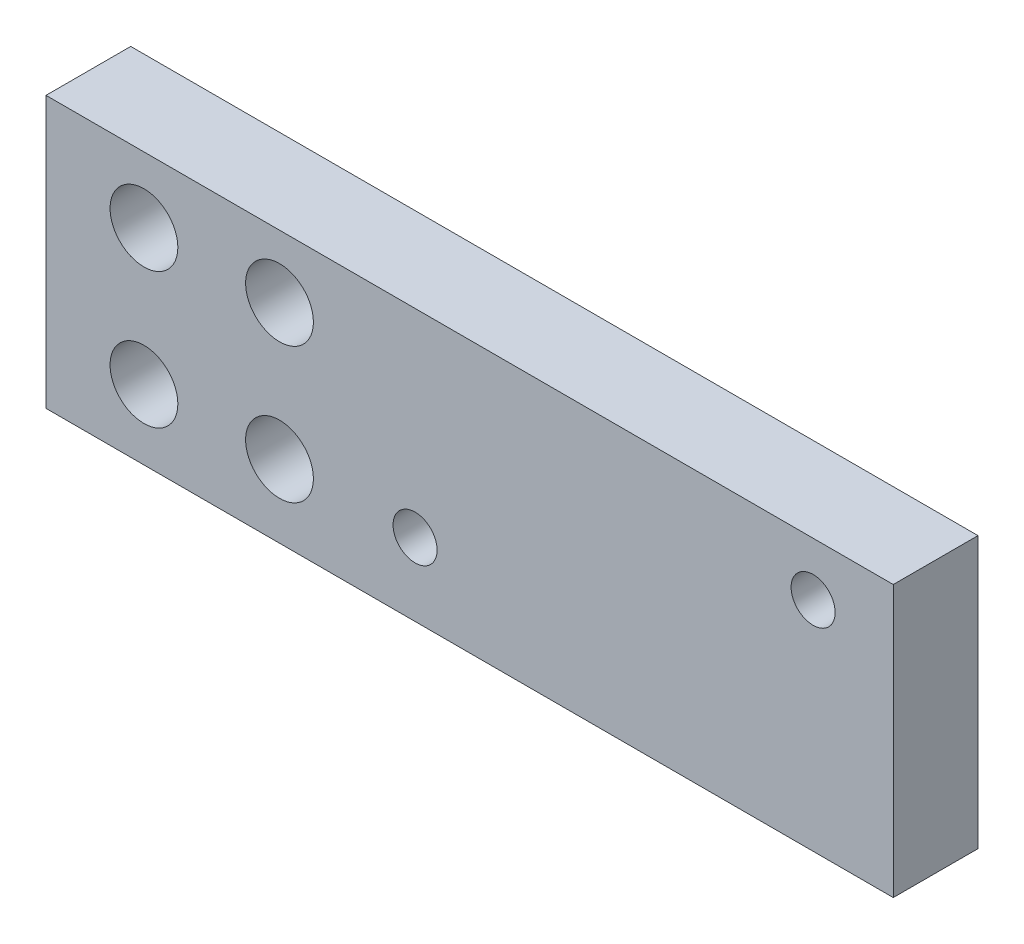
ISO-10303-21;
HEADER;
FILE_DESCRIPTION(('STEP AP214'),'2;1');
FILE_NAME('part.step','',(''),(''),'','','');
FILE_SCHEMA(('AUTOMOTIVE_DESIGN { 1 0 10303 214 1 1 1 1 }'));
ENDSEC;
DATA;
#1=APPLICATION_CONTEXT('core data for automotive mechanical design processes');
#2=APPLICATION_PROTOCOL_DEFINITION('international standard','automotive_design',2000,#1);
#3=PRODUCT_CONTEXT('',#1,'mechanical');
#4=PRODUCT('Part','Part','',(#3));
#5=PRODUCT_RELATED_PRODUCT_CATEGORY('part','',(#4));
#6=PRODUCT_DEFINITION_FORMATION('','',#4);
#7=PRODUCT_DEFINITION_CONTEXT('part definition',#1,'design');
#8=PRODUCT_DEFINITION('design','',#6,#7);
#9=PRODUCT_DEFINITION_SHAPE('','',#8);
#10=(LENGTH_UNIT() NAMED_UNIT(*) SI_UNIT(.MILLI.,.METRE.));
#11=(NAMED_UNIT(*) PLANE_ANGLE_UNIT() SI_UNIT($,.RADIAN.));
#12=(NAMED_UNIT(*) SI_UNIT($,.STERADIAN.) SOLID_ANGLE_UNIT());
#13=UNCERTAINTY_MEASURE_WITH_UNIT(LENGTH_MEASURE(1.E-05),#10,'distance_accuracy_value','');
#14=(GEOMETRIC_REPRESENTATION_CONTEXT(3) GLOBAL_UNCERTAINTY_ASSIGNED_CONTEXT((#13)) GLOBAL_UNIT_ASSIGNED_CONTEXT((#10,
#11,#12)) REPRESENTATION_CONTEXT('',''));
#15=CARTESIAN_POINT('',(0.,0.,0.));
#16=DIRECTION('',(0.,0.,1.));
#17=DIRECTION('',(1.,0.,0.));
#18=AXIS2_PLACEMENT_3D('',#15,#16,#17);
#19=CARTESIAN_POINT('',(0.,0.,5.));
#20=DIRECTION('',(0.,0.,-1.));
#21=DIRECTION('',(-1.,0.,0.));
#22=AXIS2_PLACEMENT_3D('',#19,#20,#21);
#23=PLANE('',#22);
#24=DIRECTION('',(1.,0.,0.));
#25=VECTOR('',#24,1.);
#26=CARTESIAN_POINT('',(-22.7860750602087,3.89851485148514,5.));
#27=LINE('',#26,#25);
#28=CARTESIAN_POINT('',(-22.7860750602087,3.89851485148514,5.));
#29=VERTEX_POINT('',#28);
#30=CARTESIAN_POINT('',(27.2139249397913,3.89851485148514,5.));
#31=VERTEX_POINT('',#30);
#32=EDGE_CURVE('E184',#29,#31,#27,.T.);
#33=ORIENTED_EDGE('',*,*,#32,.F.);
#34=DIRECTION('',(0.,-1.,0.));
#35=VECTOR('',#34,1.);
#36=CARTESIAN_POINT('',(-22.7860750602087,3.89851485148514,5.));
#37=LINE('',#36,#35);
#38=CARTESIAN_POINT('',(-22.7860750602087,-12.1014851485149,5.));
#39=VERTEX_POINT('',#38);
#40=EDGE_CURVE('E174',#29,#39,#37,.T.);
#41=ORIENTED_EDGE('',*,*,#40,.T.);
#42=DIRECTION('',(1.,0.,0.));
#43=VECTOR('',#42,1.);
#44=CARTESIAN_POINT('',(-22.7860750602087,-12.1014851485149,5.));
#45=LINE('',#44,#43);
#46=CARTESIAN_POINT('',(27.2139249397913,-12.1014851485149,5.));
#47=VERTEX_POINT('',#46);
#48=EDGE_CURVE('E169',#39,#47,#45,.T.);
#49=ORIENTED_EDGE('',*,*,#48,.T.);
#50=DIRECTION('',(0.,-1.,0.));
#51=VECTOR('',#50,1.);
#52=CARTESIAN_POINT('',(27.2139249397913,3.89851485148514,5.));
#53=LINE('',#52,#51);
#54=EDGE_CURVE('E173',#31,#47,#53,.T.);
#55=ORIENTED_EDGE('',*,*,#54,.F.);
#56=EDGE_LOOP('',(#33,#41,#49,#55));
#57=FACE_BOUND('',#56,.T.);
#58=CARTESIAN_POINT('',(22.4839383449832,0.74863983720937,5.));
#59=DIRECTION('',(0.,0.,1.));
#60=DIRECTION('',(1.,0.,0.));
#61=AXIS2_PLACEMENT_3D('',#58,#59,#60);
#62=CIRCLE('',#61,1.3);
#63=CARTESIAN_POINT('',(23.7839383449832,0.74863983720937,5.));
#64=VERTEX_POINT('',#63);
#65=EDGE_CURVE('E194',#64,#64,#62,.T.);
#66=ORIENTED_EDGE('',*,*,#65,.F.);
#67=EDGE_LOOP('',(#66));
#68=FACE_BOUND('',#67,.T.);
#69=CARTESIAN_POINT('',(-17.0059691899728,-7.98267326732673,5.));
#70=DIRECTION('',(0.,0.,1.));
#71=DIRECTION('',(1.,0.,0.));
#72=AXIS2_PLACEMENT_3D('',#69,#70,#71);
#73=CIRCLE('',#72,2.);
#74=CARTESIAN_POINT('',(-15.0059691899728,-7.98267326732673,5.));
#75=VERTEX_POINT('',#74);
#76=EDGE_CURVE('E237',#75,#75,#73,.T.);
#77=ORIENTED_EDGE('',*,*,#76,.F.);
#78=EDGE_LOOP('',(#77));
#79=FACE_BOUND('',#78,.T.);
#80=CARTESIAN_POINT('',(-17.0059691899728,0.0173267326732673,5.));
#81=DIRECTION('',(0.,0.,1.));
#82=DIRECTION('',(1.,0.,0.));
#83=AXIS2_PLACEMENT_3D('',#80,#81,#82);
#84=CIRCLE('',#83,2.);
#85=CARTESIAN_POINT('',(-15.0059691899728,0.0173267326732673,5.));
#86=VERTEX_POINT('',#85);
#87=EDGE_CURVE('E244',#86,#86,#84,.T.);
#88=ORIENTED_EDGE('',*,*,#87,.F.);
#89=EDGE_LOOP('',(#88));
#90=FACE_BOUND('',#89,.T.);
#91=CARTESIAN_POINT('',(-1.00596918997278,-7.80847673317924,5.));
#92=DIRECTION('',(0.,0.,1.));
#93=DIRECTION('',(1.,0.,0.));
#94=AXIS2_PLACEMENT_3D('',#91,#92,#93);
#95=CIRCLE('',#94,1.3);
#96=CARTESIAN_POINT('',(0.29403081002722,-7.80847673317924,5.));
#97=VERTEX_POINT('',#96);
#98=EDGE_CURVE('E249',#97,#97,#95,.T.);
#99=ORIENTED_EDGE('',*,*,#98,.F.);
#100=EDGE_LOOP('',(#99));
#101=FACE_BOUND('',#100,.T.);
#102=CARTESIAN_POINT('',(-9.00596918997278,-7.80847673317924,5.));
#103=DIRECTION('',(0.,0.,1.));
#104=DIRECTION('',(1.,0.,0.));
#105=AXIS2_PLACEMENT_3D('',#102,#103,#104);
#106=CIRCLE('',#105,2.);
#107=CARTESIAN_POINT('',(-7.00596918997278,-7.80847673317924,5.));
#108=VERTEX_POINT('',#107);
#109=EDGE_CURVE('E255',#108,#108,#106,.T.);
#110=ORIENTED_EDGE('',*,*,#109,.F.);
#111=EDGE_LOOP('',(#110));
#112=FACE_BOUND('',#111,.T.);
#113=CARTESIAN_POINT('',(-9.00596918997278,0.191523266820761,5.));
#114=DIRECTION('',(0.,0.,1.));
#115=DIRECTION('',(1.,0.,0.));
#116=AXIS2_PLACEMENT_3D('',#113,#114,#115);
#117=CIRCLE('',#116,2.);
#118=CARTESIAN_POINT('',(-7.00596918997278,0.191523266820761,5.));
#119=VERTEX_POINT('',#118);
#120=EDGE_CURVE('E261',#119,#119,#117,.T.);
#121=ORIENTED_EDGE('',*,*,#120,.F.);
#122=EDGE_LOOP('',(#121));
#123=FACE_BOUND('',#122,.T.);
#124=ADVANCED_FACE('F123',(#57,#68,#79,#90,#101,#112,#123),#23,.F.);
#125=CARTESIAN_POINT('',(0.,0.,0.));
#126=DIRECTION('',(0.,0.,-1.));
#127=DIRECTION('',(-1.,0.,0.));
#128=AXIS2_PLACEMENT_3D('',#125,#126,#127);
#129=PLANE('',#128);
#130=CARTESIAN_POINT('',(-9.00596918997278,-7.80847673317924,0.));
#131=DIRECTION('',(0.,0.,1.));
#132=DIRECTION('',(1.,0.,0.));
#133=AXIS2_PLACEMENT_3D('',#130,#131,#132);
#134=CIRCLE('',#133,2.);
#135=CARTESIAN_POINT('',(-7.00596918997278,-7.80847673317924,0.));
#136=VERTEX_POINT('',#135);
#137=EDGE_CURVE('E258',#136,#136,#134,.T.);
#138=ORIENTED_EDGE('',*,*,#137,.T.);
#139=EDGE_LOOP('',(#138));
#140=FACE_BOUND('',#139,.T.);
#141=CARTESIAN_POINT('',(-17.0059691899728,0.0173267326732673,0.));
#142=DIRECTION('',(0.,0.,1.));
#143=DIRECTION('',(1.,0.,0.));
#144=AXIS2_PLACEMENT_3D('',#141,#142,#143);
#145=CIRCLE('',#144,2.);
#146=CARTESIAN_POINT('',(-15.0059691899728,0.0173267326732673,0.));
#147=VERTEX_POINT('',#146);
#148=EDGE_CURVE('E246',#147,#147,#145,.T.);
#149=ORIENTED_EDGE('',*,*,#148,.T.);
#150=EDGE_LOOP('',(#149));
#151=FACE_BOUND('',#150,.T.);
#152=CARTESIAN_POINT('',(22.4839383449832,0.74863983720937,0.));
#153=DIRECTION('',(0.,0.,1.));
#154=DIRECTION('',(1.,0.,0.));
#155=AXIS2_PLACEMENT_3D('',#152,#153,#154);
#156=CIRCLE('',#155,1.3);
#157=CARTESIAN_POINT('',(23.7839383449832,0.74863983720937,0.));
#158=VERTEX_POINT('',#157);
#159=EDGE_CURVE('E235',#158,#158,#156,.T.);
#160=ORIENTED_EDGE('',*,*,#159,.T.);
#161=EDGE_LOOP('',(#160));
#162=FACE_BOUND('',#161,.T.);
#163=DIRECTION('',(1.,0.,0.));
#164=VECTOR('',#163,1.);
#165=CARTESIAN_POINT('',(-22.7860750602087,3.89851485148514,0.));
#166=LINE('',#165,#164);
#167=CARTESIAN_POINT('',(-22.7860750602087,3.89851485148514,0.));
#168=VERTEX_POINT('',#167);
#169=CARTESIAN_POINT('',(27.2139249397913,3.89851485148514,0.));
#170=VERTEX_POINT('',#169);
#171=EDGE_CURVE('E190',#168,#170,#166,.T.);
#172=ORIENTED_EDGE('',*,*,#171,.T.);
#173=DIRECTION('',(0.,-1.,0.));
#174=VECTOR('',#173,1.);
#175=CARTESIAN_POINT('',(27.2139249397913,3.89851485148514,0.));
#176=LINE('',#175,#174);
#177=CARTESIAN_POINT('',(27.2139249397913,-12.1014851485149,0.));
#178=VERTEX_POINT('',#177);
#179=EDGE_CURVE('E193',#170,#178,#176,.T.);
#180=ORIENTED_EDGE('',*,*,#179,.T.);
#181=DIRECTION('',(1.,0.,0.));
#182=VECTOR('',#181,1.);
#183=CARTESIAN_POINT('',(-22.7860750602087,-12.1014851485149,0.));
#184=LINE('',#183,#182);
#185=CARTESIAN_POINT('',(-22.7860750602087,-12.1014851485149,0.));
#186=VERTEX_POINT('',#185);
#187=EDGE_CURVE('E181',#186,#178,#184,.T.);
#188=ORIENTED_EDGE('',*,*,#187,.F.);
#189=DIRECTION('',(0.,-1.,0.));
#190=VECTOR('',#189,1.);
#191=CARTESIAN_POINT('',(-22.7860750602087,3.89851485148514,0.));
#192=LINE('',#191,#190);
#193=EDGE_CURVE('E157',#168,#186,#192,.T.);
#194=ORIENTED_EDGE('',*,*,#193,.F.);
#195=EDGE_LOOP('',(#172,#180,#188,#194));
#196=FACE_BOUND('',#195,.T.);
#197=CARTESIAN_POINT('',(-17.0059691899728,-7.98267326732673,0.));
#198=DIRECTION('',(0.,0.,1.));
#199=DIRECTION('',(1.,0.,0.));
#200=AXIS2_PLACEMENT_3D('',#197,#198,#199);
#201=CIRCLE('',#200,2.);
#202=CARTESIAN_POINT('',(-15.0059691899728,-7.98267326732673,0.));
#203=VERTEX_POINT('',#202);
#204=EDGE_CURVE('E240',#203,#203,#201,.T.);
#205=ORIENTED_EDGE('',*,*,#204,.T.);
#206=EDGE_LOOP('',(#205));
#207=FACE_BOUND('',#206,.T.);
#208=CARTESIAN_POINT('',(-1.00596918997278,-7.80847673317924,0.));
#209=DIRECTION('',(0.,0.,1.));
#210=DIRECTION('',(1.,0.,0.));
#211=AXIS2_PLACEMENT_3D('',#208,#209,#210);
#212=CIRCLE('',#211,1.3);
#213=CARTESIAN_POINT('',(0.29403081002722,-7.80847673317924,0.));
#214=VERTEX_POINT('',#213);
#215=EDGE_CURVE('E252',#214,#214,#212,.T.);
#216=ORIENTED_EDGE('',*,*,#215,.T.);
#217=EDGE_LOOP('',(#216));
#218=FACE_BOUND('',#217,.T.);
#219=CARTESIAN_POINT('',(-9.00596918997278,0.191523266820761,0.));
#220=DIRECTION('',(0.,0.,1.));
#221=DIRECTION('',(1.,0.,0.));
#222=AXIS2_PLACEMENT_3D('',#219,#220,#221);
#223=CIRCLE('',#222,2.);
#224=CARTESIAN_POINT('',(-7.00596918997278,0.191523266820761,0.));
#225=VERTEX_POINT('',#224);
#226=EDGE_CURVE('E264',#225,#225,#223,.T.);
#227=ORIENTED_EDGE('',*,*,#226,.T.);
#228=EDGE_LOOP('',(#227));
#229=FACE_BOUND('',#228,.T.);
#230=ADVANCED_FACE('F199',(#140,#151,#162,#196,#207,#218,#229),#129,.T.);
#231=CARTESIAN_POINT('',(-22.7860750602087,3.89851485148514,5.));
#232=DIRECTION('',(0.,1.,0.));
#233=DIRECTION('',(0.,0.,1.));
#234=AXIS2_PLACEMENT_3D('',#231,#232,#233);
#235=PLANE('',#234);
#236=ORIENTED_EDGE('',*,*,#171,.F.);
#237=DIRECTION('',(0.,0.,-1.));
#238=VECTOR('',#237,1.);
#239=CARTESIAN_POINT('',(-22.7860750602087,3.89851485148514,5.));
#240=LINE('',#239,#238);
#241=EDGE_CURVE('E12',#29,#168,#240,.T.);
#242=ORIENTED_EDGE('',*,*,#241,.F.);
#243=ORIENTED_EDGE('',*,*,#32,.T.);
#244=DIRECTION('',(0.,0.,-1.));
#245=VECTOR('',#244,1.);
#246=CARTESIAN_POINT('',(27.2139249397913,3.89851485148514,5.));
#247=LINE('',#246,#245);
#248=EDGE_CURVE('E127',#31,#170,#247,.T.);
#249=ORIENTED_EDGE('',*,*,#248,.T.);
#250=EDGE_LOOP('',(#236,#242,#243,#249));
#251=FACE_BOUND('',#250,.T.);
#252=ADVANCED_FACE('F125',(#251),#235,.T.);
#253=CARTESIAN_POINT('',(-22.7860750602087,3.89851485148514,5.));
#254=DIRECTION('',(1.,0.,0.));
#255=DIRECTION('',(0.,0.,-1.));
#256=AXIS2_PLACEMENT_3D('',#253,#254,#255);
#257=PLANE('',#256);
#258=ORIENTED_EDGE('',*,*,#193,.T.);
#259=DIRECTION('',(0.,0.,-1.));
#260=VECTOR('',#259,1.);
#261=CARTESIAN_POINT('',(-22.7860750602087,-12.1014851485149,5.));
#262=LINE('',#261,#260);
#263=EDGE_CURVE('E133',#39,#186,#262,.T.);
#264=ORIENTED_EDGE('',*,*,#263,.F.);
#265=ORIENTED_EDGE('',*,*,#40,.F.);
#266=ORIENTED_EDGE('',*,*,#241,.T.);
#267=EDGE_LOOP('',(#258,#264,#265,#266));
#268=FACE_BOUND('',#267,.T.);
#269=ADVANCED_FACE('F202',(#268),#257,.F.);
#270=CARTESIAN_POINT('',(-22.7860750602087,-12.1014851485149,5.));
#271=DIRECTION('',(0.,1.,0.));
#272=DIRECTION('',(0.,0.,1.));
#273=AXIS2_PLACEMENT_3D('',#270,#271,#272);
#274=PLANE('',#273);
#275=ORIENTED_EDGE('',*,*,#187,.T.);
#276=DIRECTION('',(0.,0.,-1.));
#277=VECTOR('',#276,1.);
#278=CARTESIAN_POINT('',(27.2139249397913,-12.1014851485149,5.));
#279=LINE('',#278,#277);
#280=EDGE_CURVE('E178',#47,#178,#279,.T.);
#281=ORIENTED_EDGE('',*,*,#280,.F.);
#282=ORIENTED_EDGE('',*,*,#48,.F.);
#283=ORIENTED_EDGE('',*,*,#263,.T.);
#284=EDGE_LOOP('',(#275,#281,#282,#283));
#285=FACE_BOUND('',#284,.T.);
#286=ADVANCED_FACE('F179',(#285),#274,.F.);
#287=CARTESIAN_POINT('',(27.2139249397913,3.89851485148514,5.));
#288=DIRECTION('',(1.,0.,0.));
#289=DIRECTION('',(0.,0.,-1.));
#290=AXIS2_PLACEMENT_3D('',#287,#288,#289);
#291=PLANE('',#290);
#292=ORIENTED_EDGE('',*,*,#179,.F.);
#293=ORIENTED_EDGE('',*,*,#248,.F.);
#294=ORIENTED_EDGE('',*,*,#54,.T.);
#295=ORIENTED_EDGE('',*,*,#280,.T.);
#296=EDGE_LOOP('',(#292,#293,#294,#295));
#297=FACE_BOUND('',#296,.T.);
#298=ADVANCED_FACE('F183',(#297),#291,.T.);
#299=CARTESIAN_POINT('',(22.4839383449832,0.74863983720937,5.));
#300=DIRECTION('',(0.,0.,-1.));
#301=DIRECTION('',(-1.,0.,0.));
#302=AXIS2_PLACEMENT_3D('',#299,#300,#301);
#303=CYLINDRICAL_SURFACE('',#302,1.3);
#304=ORIENTED_EDGE('',*,*,#65,.T.);
#305=EDGE_LOOP('',(#304));
#306=FACE_BOUND('',#305,.T.);
#307=ORIENTED_EDGE('',*,*,#159,.F.);
#308=EDGE_LOOP('',(#307));
#309=FACE_BOUND('',#308,.T.);
#310=ADVANCED_FACE('F215',(#306,#309),#303,.F.);
#311=CARTESIAN_POINT('',(-17.0059691899728,-7.98267326732673,5.));
#312=DIRECTION('',(0.,0.,-1.));
#313=DIRECTION('',(-1.,0.,0.));
#314=AXIS2_PLACEMENT_3D('',#311,#312,#313);
#315=CYLINDRICAL_SURFACE('',#314,2.);
#316=ORIENTED_EDGE('',*,*,#76,.T.);
#317=EDGE_LOOP('',(#316));
#318=FACE_BOUND('',#317,.T.);
#319=ORIENTED_EDGE('',*,*,#204,.F.);
#320=EDGE_LOOP('',(#319));
#321=FACE_BOUND('',#320,.T.);
#322=ADVANCED_FACE('F223',(#318,#321),#315,.F.);
#323=CARTESIAN_POINT('',(-17.0059691899728,0.0173267326732673,5.));
#324=DIRECTION('',(0.,0.,-1.));
#325=DIRECTION('',(-1.,0.,0.));
#326=AXIS2_PLACEMENT_3D('',#323,#324,#325);
#327=CYLINDRICAL_SURFACE('',#326,2.);
#328=ORIENTED_EDGE('',*,*,#87,.T.);
#329=EDGE_LOOP('',(#328));
#330=FACE_BOUND('',#329,.T.);
#331=ORIENTED_EDGE('',*,*,#148,.F.);
#332=EDGE_LOOP('',(#331));
#333=FACE_BOUND('',#332,.T.);
#334=ADVANCED_FACE('F228',(#330,#333),#327,.F.);
#335=CARTESIAN_POINT('',(-1.00596918997278,-7.80847673317924,5.));
#336=DIRECTION('',(0.,0.,-1.));
#337=DIRECTION('',(-1.,0.,0.));
#338=AXIS2_PLACEMENT_3D('',#335,#336,#337);
#339=CYLINDRICAL_SURFACE('',#338,1.3);
#340=ORIENTED_EDGE('',*,*,#98,.T.);
#341=EDGE_LOOP('',(#340));
#342=FACE_BOUND('',#341,.T.);
#343=ORIENTED_EDGE('',*,*,#215,.F.);
#344=EDGE_LOOP('',(#343));
#345=FACE_BOUND('',#344,.T.);
#346=ADVANCED_FACE('F281',(#342,#345),#339,.F.);
#347=CARTESIAN_POINT('',(-9.00596918997278,-7.80847673317924,5.));
#348=DIRECTION('',(0.,0.,-1.));
#349=DIRECTION('',(-1.,0.,0.));
#350=AXIS2_PLACEMENT_3D('',#347,#348,#349);
#351=CYLINDRICAL_SURFACE('',#350,2.);
#352=ORIENTED_EDGE('',*,*,#109,.T.);
#353=EDGE_LOOP('',(#352));
#354=FACE_BOUND('',#353,.T.);
#355=ORIENTED_EDGE('',*,*,#137,.F.);
#356=EDGE_LOOP('',(#355));
#357=FACE_BOUND('',#356,.T.);
#358=ADVANCED_FACE('F274',(#354,#357),#351,.F.);
#359=CARTESIAN_POINT('',(-9.00596918997278,0.191523266820761,5.));
#360=DIRECTION('',(0.,0.,-1.));
#361=DIRECTION('',(-1.,0.,0.));
#362=AXIS2_PLACEMENT_3D('',#359,#360,#361);
#363=CYLINDRICAL_SURFACE('',#362,2.);
#364=ORIENTED_EDGE('',*,*,#120,.T.);
#365=EDGE_LOOP('',(#364));
#366=FACE_BOUND('',#365,.T.);
#367=ORIENTED_EDGE('',*,*,#226,.F.);
#368=EDGE_LOOP('',(#367));
#369=FACE_BOUND('',#368,.T.);
#370=ADVANCED_FACE('F270',(#366,#369),#363,.F.);
#371=CLOSED_SHELL('',(#124,#230,#252,#269,#286,#298,#310,#322,#334,#346,#358,#370));
#372=MANIFOLD_SOLID_BREP('B2',#371);
#373=ADVANCED_BREP_SHAPE_REPRESENTATION('',(#18,#372),#14);
#374=SHAPE_DEFINITION_REPRESENTATION(#9,#373);
ENDSEC;
END-ISO-10303-21;
